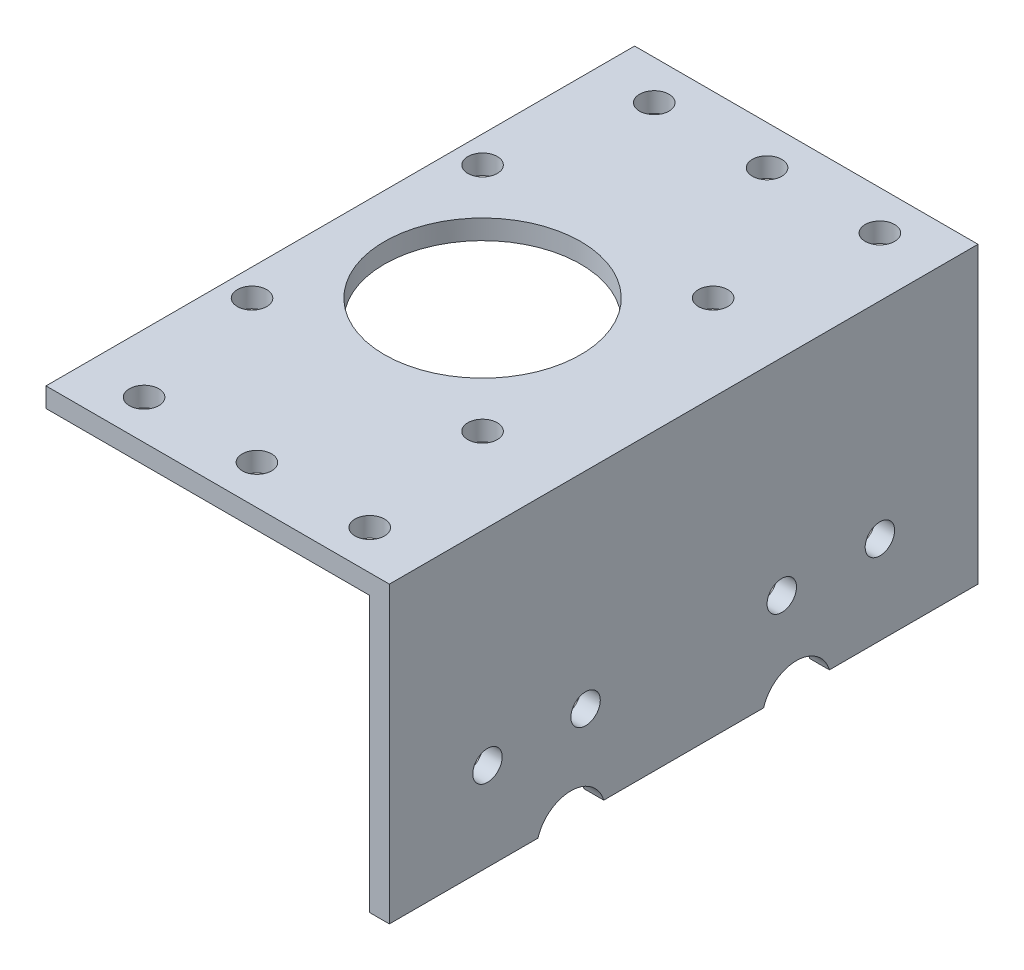
ISO-10303-21;
HEADER;
FILE_DESCRIPTION(('STEP AP214'),'2;1');
FILE_NAME('part.step','',(''),(''),'','','');
FILE_SCHEMA(('AUTOMOTIVE_DESIGN { 1 0 10303 214 1 1 1 1 }'));
ENDSEC;
DATA;
#1=APPLICATION_CONTEXT('core data for automotive mechanical design processes');
#2=APPLICATION_PROTOCOL_DEFINITION('international standard','automotive_design',2000,#1);
#3=PRODUCT_CONTEXT('',#1,'mechanical');
#4=PRODUCT('Part','Part','',(#3));
#5=PRODUCT_RELATED_PRODUCT_CATEGORY('part','',(#4));
#6=PRODUCT_DEFINITION_FORMATION('','',#4);
#7=PRODUCT_DEFINITION_CONTEXT('part definition',#1,'design');
#8=PRODUCT_DEFINITION('design','',#6,#7);
#9=PRODUCT_DEFINITION_SHAPE('','',#8);
#10=(LENGTH_UNIT() NAMED_UNIT(*) SI_UNIT(.MILLI.,.METRE.));
#11=(NAMED_UNIT(*) PLANE_ANGLE_UNIT() SI_UNIT($,.RADIAN.));
#12=(NAMED_UNIT(*) SI_UNIT($,.STERADIAN.) SOLID_ANGLE_UNIT());
#13=UNCERTAINTY_MEASURE_WITH_UNIT(LENGTH_MEASURE(1.E-05),#10,'distance_accuracy_value','');
#14=(GEOMETRIC_REPRESENTATION_CONTEXT(3) GLOBAL_UNCERTAINTY_ASSIGNED_CONTEXT((#13)) GLOBAL_UNIT_ASSIGNED_CONTEXT((#10,
#11,#12)) REPRESENTATION_CONTEXT('',''));
#15=CARTESIAN_POINT('',(0.,0.,0.));
#16=DIRECTION('',(0.,0.,1.));
#17=DIRECTION('',(1.,0.,0.));
#18=AXIS2_PLACEMENT_3D('',#15,#16,#17);
#19=CARTESIAN_POINT('',(0.,-60.,60.));
#20=DIRECTION('',(0.,1.,0.));
#21=DIRECTION('',(0.,0.,1.));
#22=AXIS2_PLACEMENT_3D('',#19,#20,#21);
#23=PLANE('',#22);
#24=DIRECTION('',(0.,0.,-1.));
#25=VECTOR('',#24,1.);
#26=CARTESIAN_POINT('',(-3.99999999999999,-60.,60.));
#27=LINE('',#26,#25);
#28=CARTESIAN_POINT('',(-3.99999999999999,-60.,16.2917960675006));
#29=VERTEX_POINT('',#28);
#30=CARTESIAN_POINT('',(-3.99999999999999,-60.,-16.2917960675006));
#31=VERTEX_POINT('',#30);
#32=EDGE_CURVE('E134',#29,#31,#27,.T.);
#33=ORIENTED_EDGE('',*,*,#32,.T.);
#34=DIRECTION('',(1.,0.,0.));
#35=VECTOR('',#34,1.);
#36=CARTESIAN_POINT('',(-9.99999999999999,-60.,-16.2917960675006));
#37=LINE('',#36,#35);
#38=CARTESIAN_POINT('',(0.,-60.,-16.2917960675006));
#39=VERTEX_POINT('',#38);
#40=EDGE_CURVE('E228',#31,#39,#37,.T.);
#41=ORIENTED_EDGE('',*,*,#40,.T.);
#42=DIRECTION('',(0.,0.,-1.));
#43=VECTOR('',#42,1.);
#44=CARTESIAN_POINT('',(0.,-60.,60.));
#45=LINE('',#44,#43);
#46=CARTESIAN_POINT('',(0.,-60.,16.2917960675006));
#47=VERTEX_POINT('',#46);
#48=EDGE_CURVE('E131',#47,#39,#45,.T.);
#49=ORIENTED_EDGE('',*,*,#48,.F.);
#50=DIRECTION('',(1.,0.,0.));
#51=VECTOR('',#50,1.);
#52=CARTESIAN_POINT('',(-9.99999999999999,-60.,16.2917960675006));
#53=LINE('',#52,#51);
#54=EDGE_CURVE('E54',#47,#29,#53,.F.);
#55=ORIENTED_EDGE('',*,*,#54,.T.);
#56=EDGE_LOOP('',(#33,#41,#49,#55));
#57=FACE_BOUND('',#56,.T.);
#58=ADVANCED_FACE('F32',(#57),#23,.F.);
#59=CARTESIAN_POINT('',(-3.99999999999999,-60.,60.));
#60=VERTEX_POINT('',#59);
#61=CARTESIAN_POINT('',(-3.99999999999999,-60.,29.7082039324994));
#62=VERTEX_POINT('',#61);
#63=EDGE_CURVE('E124',#60,#62,#27,.T.);
#64=ORIENTED_EDGE('',*,*,#63,.T.);
#65=DIRECTION('',(1.,0.,0.));
#66=VECTOR('',#65,1.);
#67=CARTESIAN_POINT('',(-9.99999999999999,-60.,29.7082039324994));
#68=LINE('',#67,#66);
#69=CARTESIAN_POINT('',(0.,-60.,29.7082039324994));
#70=VERTEX_POINT('',#69);
#71=EDGE_CURVE('E108',#62,#70,#68,.T.);
#72=ORIENTED_EDGE('',*,*,#71,.T.);
#73=CARTESIAN_POINT('',(0.,-60.,60.));
#74=VERTEX_POINT('',#73);
#75=EDGE_CURVE('E121',#74,#70,#45,.T.);
#76=ORIENTED_EDGE('',*,*,#75,.F.);
#77=DIRECTION('',(1.,0.,0.));
#78=VECTOR('',#77,1.);
#79=CARTESIAN_POINT('',(0.,-60.,60.));
#80=LINE('',#79,#78);
#81=EDGE_CURVE('E167',#60,#74,#80,.T.);
#82=ORIENTED_EDGE('',*,*,#81,.F.);
#83=EDGE_LOOP('',(#64,#72,#76,#82));
#84=FACE_BOUND('',#83,.T.);
#85=ADVANCED_FACE('F119',(#84),#23,.F.);
#86=CARTESIAN_POINT('',(-70.,-4.,60.));
#87=DIRECTION('',(1.,0.,0.));
#88=DIRECTION('',(0.,0.,-1.));
#89=AXIS2_PLACEMENT_3D('',#86,#87,#88);
#90=PLANE('',#89);
#91=DIRECTION('',(0.,-1.,0.));
#92=VECTOR('',#91,1.);
#93=CARTESIAN_POINT('',(-70.,-4.,-60.));
#94=LINE('',#93,#92);
#95=CARTESIAN_POINT('',(-70.,0.,-60.));
#96=VERTEX_POINT('',#95);
#97=CARTESIAN_POINT('',(-70.,-4.,-60.));
#98=VERTEX_POINT('',#97);
#99=EDGE_CURVE('E161',#96,#98,#94,.T.);
#100=ORIENTED_EDGE('',*,*,#99,.T.);
#101=DIRECTION('',(0.,0.,-1.));
#102=VECTOR('',#101,1.);
#103=CARTESIAN_POINT('',(-70.,-4.,60.));
#104=LINE('',#103,#102);
#105=CARTESIAN_POINT('',(-70.,-4.,60.));
#106=VERTEX_POINT('',#105);
#107=EDGE_CURVE('E40',#106,#98,#104,.T.);
#108=ORIENTED_EDGE('',*,*,#107,.F.);
#109=DIRECTION('',(0.,-1.,0.));
#110=VECTOR('',#109,1.);
#111=CARTESIAN_POINT('',(-70.,-4.,60.));
#112=LINE('',#111,#110);
#113=CARTESIAN_POINT('',(-70.,0.,60.));
#114=VERTEX_POINT('',#113);
#115=EDGE_CURVE('E151',#114,#106,#112,.T.);
#116=ORIENTED_EDGE('',*,*,#115,.F.);
#117=DIRECTION('',(0.,0.,-1.));
#118=VECTOR('',#117,1.);
#119=CARTESIAN_POINT('',(-70.,0.,60.));
#120=LINE('',#119,#118);
#121=EDGE_CURVE('E141',#114,#96,#120,.T.);
#122=ORIENTED_EDGE('',*,*,#121,.T.);
#123=EDGE_LOOP('',(#100,#108,#116,#122));
#124=FACE_BOUND('',#123,.T.);
#125=ADVANCED_FACE('F34',(#124),#90,.F.);
#126=CARTESIAN_POINT('',(-3.99999999999999,-3.99999999999999,60.));
#127=DIRECTION('',(0.,1.,0.));
#128=DIRECTION('',(-1.,0.,0.));
#129=AXIS2_PLACEMENT_3D('',#126,#127,#128);
#130=PLANE('',#129);
#131=CARTESIAN_POINT('',(-35.,-3.99999999999999,52.));
#132=DIRECTION('',(0.,1.,0.));
#133=DIRECTION('',(-1.,0.,0.));
#134=AXIS2_PLACEMENT_3D('',#131,#132,#133);
#135=CIRCLE('',#134,3.);
#136=CARTESIAN_POINT('',(-38.,-4.,52.));
#137=VERTEX_POINT('',#136);
#138=EDGE_CURVE('E114',#137,#137,#135,.T.);
#139=ORIENTED_EDGE('',*,*,#138,.T.);
#140=EDGE_LOOP('',(#139));
#141=FACE_BOUND('',#140,.T.);
#142=CARTESIAN_POINT('',(-12.,-3.99999999999999,52.));
#143=DIRECTION('',(0.,1.,0.));
#144=DIRECTION('',(-1.,0.,0.));
#145=AXIS2_PLACEMENT_3D('',#142,#143,#144);
#146=CIRCLE('',#145,3.);
#147=CARTESIAN_POINT('',(-15.,-3.99999999999999,52.));
#148=VERTEX_POINT('',#147);
#149=EDGE_CURVE('E239',#148,#148,#146,.T.);
#150=ORIENTED_EDGE('',*,*,#149,.T.);
#151=EDGE_LOOP('',(#150));
#152=FACE_BOUND('',#151,.T.);
#153=CARTESIAN_POINT('',(-58.,-4.,-52.));
#154=DIRECTION('',(0.,1.,0.));
#155=DIRECTION('',(-1.,0.,0.));
#156=AXIS2_PLACEMENT_3D('',#153,#154,#155);
#157=CIRCLE('',#156,3.00000000000001);
#158=CARTESIAN_POINT('',(-61.,-4.,-52.));
#159=VERTEX_POINT('',#158);
#160=EDGE_CURVE('E242',#159,#159,#157,.T.);
#161=ORIENTED_EDGE('',*,*,#160,.T.);
#162=EDGE_LOOP('',(#161));
#163=FACE_BOUND('',#162,.T.);
#164=CARTESIAN_POINT('',(-35.,-3.99999999999999,-52.));
#165=DIRECTION('',(0.,1.,0.));
#166=DIRECTION('',(-1.,0.,0.));
#167=AXIS2_PLACEMENT_3D('',#164,#165,#166);
#168=CIRCLE('',#167,3.);
#169=CARTESIAN_POINT('',(-38.,-4.,-52.));
#170=VERTEX_POINT('',#169);
#171=EDGE_CURVE('E245',#170,#170,#168,.T.);
#172=ORIENTED_EDGE('',*,*,#171,.T.);
#173=EDGE_LOOP('',(#172));
#174=FACE_BOUND('',#173,.T.);
#175=CARTESIAN_POINT('',(-12.,-3.99999999999999,-52.));
#176=DIRECTION('',(0.,1.,0.));
#177=DIRECTION('',(-1.,0.,0.));
#178=AXIS2_PLACEMENT_3D('',#175,#176,#177);
#179=CIRCLE('',#178,3.);
#180=CARTESIAN_POINT('',(-15.,-3.99999999999999,-52.));
#181=VERTEX_POINT('',#180);
#182=EDGE_CURVE('E248',#181,#181,#179,.T.);
#183=ORIENTED_EDGE('',*,*,#182,.T.);
#184=EDGE_LOOP('',(#183));
#185=FACE_BOUND('',#184,.T.);
#186=CARTESIAN_POINT('',(-58.,-4.,52.));
#187=DIRECTION('',(0.,1.,0.));
#188=DIRECTION('',(-1.,0.,0.));
#189=AXIS2_PLACEMENT_3D('',#186,#187,#188);
#190=CIRCLE('',#189,3.00000000000001);
#191=CARTESIAN_POINT('',(-61.,-4.,52.));
#192=VERTEX_POINT('',#191);
#193=EDGE_CURVE('E251',#192,#192,#190,.T.);
#194=ORIENTED_EDGE('',*,*,#193,.T.);
#195=EDGE_LOOP('',(#194));
#196=FACE_BOUND('',#195,.T.);
#197=CARTESIAN_POINT('',(-64.5,-4.,23.5));
#198=DIRECTION('',(0.,1.,0.));
#199=DIRECTION('',(-1.,0.,0.));
#200=AXIS2_PLACEMENT_3D('',#197,#198,#199);
#201=CIRCLE('',#200,3.00000000000001);
#202=CARTESIAN_POINT('',(-67.5,-4.,23.5));
#203=VERTEX_POINT('',#202);
#204=EDGE_CURVE('E164',#203,#203,#201,.T.);
#205=ORIENTED_EDGE('',*,*,#204,.T.);
#206=EDGE_LOOP('',(#205));
#207=FACE_BOUND('',#206,.T.);
#208=CARTESIAN_POINT('',(-17.5,-3.99999999999999,23.5));
#209=DIRECTION('',(0.,1.,0.));
#210=DIRECTION('',(-1.,0.,0.));
#211=AXIS2_PLACEMENT_3D('',#208,#209,#210);
#212=CIRCLE('',#211,3.);
#213=CARTESIAN_POINT('',(-20.5,-3.99999999999999,23.5));
#214=VERTEX_POINT('',#213);
#215=EDGE_CURVE('E177',#214,#214,#212,.T.);
#216=ORIENTED_EDGE('',*,*,#215,.T.);
#217=EDGE_LOOP('',(#216));
#218=FACE_BOUND('',#217,.T.);
#219=CARTESIAN_POINT('',(-64.5,-4.,-23.5));
#220=DIRECTION('',(0.,1.,0.));
#221=DIRECTION('',(-1.,0.,0.));
#222=AXIS2_PLACEMENT_3D('',#219,#220,#221);
#223=CIRCLE('',#222,3.00000000000001);
#224=CARTESIAN_POINT('',(-67.5,-4.,-23.5));
#225=VERTEX_POINT('',#224);
#226=EDGE_CURVE('E180',#225,#225,#223,.T.);
#227=ORIENTED_EDGE('',*,*,#226,.T.);
#228=EDGE_LOOP('',(#227));
#229=FACE_BOUND('',#228,.T.);
#230=CARTESIAN_POINT('',(-17.5,-3.99999999999999,-23.5));
#231=DIRECTION('',(0.,1.,0.));
#232=DIRECTION('',(-1.,0.,0.));
#233=AXIS2_PLACEMENT_3D('',#230,#231,#232);
#234=CIRCLE('',#233,3.);
#235=CARTESIAN_POINT('',(-20.5,-3.99999999999999,-23.5));
#236=VERTEX_POINT('',#235);
#237=EDGE_CURVE('E183',#236,#236,#234,.T.);
#238=ORIENTED_EDGE('',*,*,#237,.T.);
#239=EDGE_LOOP('',(#238));
#240=FACE_BOUND('',#239,.T.);
#241=CARTESIAN_POINT('',(-41.,-4.,0.));
#242=DIRECTION('',(0.,1.,0.));
#243=DIRECTION('',(-1.,0.,0.));
#244=AXIS2_PLACEMENT_3D('',#241,#242,#243);
#245=CIRCLE('',#244,20.);
#246=CARTESIAN_POINT('',(-61.,-4.,0.));
#247=VERTEX_POINT('',#246);
#248=EDGE_CURVE('E186',#247,#247,#245,.T.);
#249=ORIENTED_EDGE('',*,*,#248,.T.);
#250=EDGE_LOOP('',(#249));
#251=FACE_BOUND('',#250,.T.);
#252=DIRECTION('',(1.,0.,0.));
#253=VECTOR('',#252,1.);
#254=CARTESIAN_POINT('',(-3.99999999999999,-3.99999999999999,-60.));
#255=LINE('',#254,#253);
#256=CARTESIAN_POINT('',(-3.99999999999999,-3.99999999999999,-60.));
#257=VERTEX_POINT('',#256);
#258=EDGE_CURVE('E159',#98,#257,#255,.T.);
#259=ORIENTED_EDGE('',*,*,#258,.T.);
#260=DIRECTION('',(0.,0.,-1.));
#261=VECTOR('',#260,1.);
#262=CARTESIAN_POINT('',(-3.99999999999999,-3.99999999999999,60.));
#263=LINE('',#262,#261);
#264=CARTESIAN_POINT('',(-3.99999999999999,-3.99999999999999,60.));
#265=VERTEX_POINT('',#264);
#266=EDGE_CURVE('E308',#265,#257,#263,.T.);
#267=ORIENTED_EDGE('',*,*,#266,.F.);
#268=DIRECTION('',(1.,0.,0.));
#269=VECTOR('',#268,1.);
#270=CARTESIAN_POINT('',(-3.99999999999999,-3.99999999999999,60.));
#271=LINE('',#270,#269);
#272=EDGE_CURVE('E171',#106,#265,#271,.T.);
#273=ORIENTED_EDGE('',*,*,#272,.F.);
#274=ORIENTED_EDGE('',*,*,#107,.T.);
#275=EDGE_LOOP('',(#259,#267,#273,#274));
#276=FACE_BOUND('',#275,.T.);
#277=ADVANCED_FACE('F307',(#141,#152,#163,#174,#185,#196,#207,#218,#229,#240,#251,#276),#130,.F.);
#278=CARTESIAN_POINT('',(-3.99999999999999,-60.,60.));
#279=DIRECTION('',(1.,0.,0.));
#280=DIRECTION('',(0.,0.,-1.));
#281=AXIS2_PLACEMENT_3D('',#278,#279,#280);
#282=PLANE('',#281);
#283=CARTESIAN_POINT('',(-3.99999999999999,-42.,-40.));
#284=DIRECTION('',(1.,0.,0.));
#285=DIRECTION('',(0.,0.,-1.));
#286=AXIS2_PLACEMENT_3D('',#283,#284,#285);
#287=CIRCLE('',#286,2.99999999999999);
#288=CARTESIAN_POINT('',(-3.99999999999999,-42.,-43.));
#289=VERTEX_POINT('',#288);
#290=EDGE_CURVE('E197',#289,#289,#287,.T.);
#291=ORIENTED_EDGE('',*,*,#290,.T.);
#292=EDGE_LOOP('',(#291));
#293=FACE_BOUND('',#292,.T.);
#294=CARTESIAN_POINT('',(-3.99999999999999,-42.,40.));
#295=DIRECTION('',(1.,0.,0.));
#296=DIRECTION('',(0.,0.,-1.));
#297=AXIS2_PLACEMENT_3D('',#294,#295,#296);
#298=CIRCLE('',#297,2.99999999999999);
#299=CARTESIAN_POINT('',(-3.99999999999999,-42.,37.));
#300=VERTEX_POINT('',#299);
#301=EDGE_CURVE('E207',#300,#300,#298,.T.);
#302=ORIENTED_EDGE('',*,*,#301,.T.);
#303=EDGE_LOOP('',(#302));
#304=FACE_BOUND('',#303,.T.);
#305=CARTESIAN_POINT('',(-3.99999999999999,-42.,20.));
#306=DIRECTION('',(1.,0.,0.));
#307=DIRECTION('',(0.,0.,-1.));
#308=AXIS2_PLACEMENT_3D('',#305,#306,#307);
#309=CIRCLE('',#308,3.);
#310=CARTESIAN_POINT('',(-3.99999999999999,-42.,17.));
#311=VERTEX_POINT('',#310);
#312=EDGE_CURVE('E210',#311,#311,#309,.T.);
#313=ORIENTED_EDGE('',*,*,#312,.T.);
#314=EDGE_LOOP('',(#313));
#315=FACE_BOUND('',#314,.T.);
#316=CARTESIAN_POINT('',(-3.99999999999999,-42.,-20.));
#317=DIRECTION('',(1.,0.,0.));
#318=DIRECTION('',(0.,0.,-1.));
#319=AXIS2_PLACEMENT_3D('',#316,#317,#318);
#320=CIRCLE('',#319,3.);
#321=CARTESIAN_POINT('',(-3.99999999999999,-42.,-23.));
#322=VERTEX_POINT('',#321);
#323=EDGE_CURVE('E213',#322,#322,#320,.T.);
#324=ORIENTED_EDGE('',*,*,#323,.T.);
#325=EDGE_LOOP('',(#324));
#326=FACE_BOUND('',#325,.T.);
#327=CARTESIAN_POINT('',(-3.99999999999999,-60.,-29.7082039324994));
#328=VERTEX_POINT('',#327);
#329=CARTESIAN_POINT('',(-3.99999999999999,-60.,-60.));
#330=VERTEX_POINT('',#329);
#331=EDGE_CURVE('E130',#328,#330,#27,.T.);
#332=ORIENTED_EDGE('',*,*,#331,.F.);
#333=CARTESIAN_POINT('',(-3.99999999999999,-62.,-23.));
#334=DIRECTION('',(1.,0.,0.));
#335=DIRECTION('',(0.,0.,-1.));
#336=AXIS2_PLACEMENT_3D('',#333,#334,#335);
#337=CIRCLE('',#336,7.);
#338=EDGE_CURVE('E231',#328,#31,#337,.T.);
#339=ORIENTED_EDGE('',*,*,#338,.T.);
#340=ORIENTED_EDGE('',*,*,#32,.F.);
#341=CARTESIAN_POINT('',(-3.99999999999999,-62.,23.));
#342=DIRECTION('',(1.,0.,0.));
#343=DIRECTION('',(0.,0.,-1.));
#344=AXIS2_PLACEMENT_3D('',#341,#342,#343);
#345=CIRCLE('',#344,7.);
#346=EDGE_CURVE('E125',#29,#62,#345,.T.);
#347=ORIENTED_EDGE('',*,*,#346,.T.);
#348=ORIENTED_EDGE('',*,*,#63,.F.);
#349=DIRECTION('',(0.,-1.,0.));
#350=VECTOR('',#349,1.);
#351=CARTESIAN_POINT('',(-3.99999999999999,-60.,60.));
#352=LINE('',#351,#350);
#353=EDGE_CURVE('E169',#265,#60,#352,.T.);
#354=ORIENTED_EDGE('',*,*,#353,.F.);
#355=ORIENTED_EDGE('',*,*,#266,.T.);
#356=DIRECTION('',(0.,-1.,0.));
#357=VECTOR('',#356,1.);
#358=CARTESIAN_POINT('',(-3.99999999999999,-60.,-60.));
#359=LINE('',#358,#357);
#360=EDGE_CURVE('E156',#257,#330,#359,.T.);
#361=ORIENTED_EDGE('',*,*,#360,.T.);
#362=EDGE_LOOP('',(#332,#339,#340,#347,#348,#354,#355,#361));
#363=FACE_BOUND('',#362,.T.);
#364=ADVANCED_FACE('F315',(#293,#304,#315,#326,#363),#282,.F.);
#365=CARTESIAN_POINT('',(0.,-60.,-29.7082039324994));
#366=VERTEX_POINT('',#365);
#367=CARTESIAN_POINT('',(0.,-60.,-60.));
#368=VERTEX_POINT('',#367);
#369=EDGE_CURVE('E133',#366,#368,#45,.T.);
#370=ORIENTED_EDGE('',*,*,#369,.F.);
#371=DIRECTION('',(1.,0.,0.));
#372=VECTOR('',#371,1.);
#373=CARTESIAN_POINT('',(-9.99999999999999,-60.,-29.7082039324994));
#374=LINE('',#373,#372);
#375=EDGE_CURVE('E47',#366,#328,#374,.F.);
#376=ORIENTED_EDGE('',*,*,#375,.T.);
#377=ORIENTED_EDGE('',*,*,#331,.T.);
#378=DIRECTION('',(1.,0.,0.));
#379=VECTOR('',#378,1.);
#380=CARTESIAN_POINT('',(0.,-60.,-60.));
#381=LINE('',#380,#379);
#382=EDGE_CURVE('E154',#330,#368,#381,.T.);
#383=ORIENTED_EDGE('',*,*,#382,.T.);
#384=EDGE_LOOP('',(#370,#376,#377,#383));
#385=FACE_BOUND('',#384,.T.);
#386=ADVANCED_FACE('F318',(#385),#23,.F.);
#387=CARTESIAN_POINT('',(0.,0.,60.));
#388=DIRECTION('',(-1.,0.,0.));
#389=DIRECTION('',(0.,-1.,0.));
#390=AXIS2_PLACEMENT_3D('',#387,#388,#389);
#391=PLANE('',#390);
#392=CARTESIAN_POINT('',(0.,-42.,-40.));
#393=DIRECTION('',(1.,0.,0.));
#394=DIRECTION('',(0.,1.,0.));
#395=AXIS2_PLACEMENT_3D('',#392,#393,#394);
#396=CIRCLE('',#395,2.99999999999999);
#397=CARTESIAN_POINT('',(0.,-39.,-40.));
#398=VERTEX_POINT('',#397);
#399=EDGE_CURVE('E219',#398,#398,#396,.T.);
#400=ORIENTED_EDGE('',*,*,#399,.F.);
#401=EDGE_LOOP('',(#400));
#402=FACE_BOUND('',#401,.T.);
#403=CARTESIAN_POINT('',(0.,-42.,40.));
#404=DIRECTION('',(1.,0.,0.));
#405=DIRECTION('',(0.,-1.,0.));
#406=AXIS2_PLACEMENT_3D('',#403,#404,#405);
#407=CIRCLE('',#406,2.99999999999999);
#408=CARTESIAN_POINT('',(0.,-45.,40.));
#409=VERTEX_POINT('',#408);
#410=EDGE_CURVE('E220',#409,#409,#407,.T.);
#411=ORIENTED_EDGE('',*,*,#410,.F.);
#412=EDGE_LOOP('',(#411));
#413=FACE_BOUND('',#412,.T.);
#414=CARTESIAN_POINT('',(0.,-42.,20.));
#415=DIRECTION('',(1.,0.,0.));
#416=DIRECTION('',(0.,-1.,0.));
#417=AXIS2_PLACEMENT_3D('',#414,#415,#416);
#418=CIRCLE('',#417,3.);
#419=CARTESIAN_POINT('',(0.,-45.,20.));
#420=VERTEX_POINT('',#419);
#421=EDGE_CURVE('E223',#420,#420,#418,.T.);
#422=ORIENTED_EDGE('',*,*,#421,.F.);
#423=EDGE_LOOP('',(#422));
#424=FACE_BOUND('',#423,.T.);
#425=CARTESIAN_POINT('',(0.,-42.,-20.));
#426=DIRECTION('',(1.,0.,0.));
#427=DIRECTION('',(0.,1.,0.));
#428=AXIS2_PLACEMENT_3D('',#425,#426,#427);
#429=CIRCLE('',#428,3.);
#430=CARTESIAN_POINT('',(0.,-39.,-20.));
#431=VERTEX_POINT('',#430);
#432=EDGE_CURVE('E216',#431,#431,#429,.T.);
#433=ORIENTED_EDGE('',*,*,#432,.F.);
#434=EDGE_LOOP('',(#433));
#435=FACE_BOUND('',#434,.T.);
#436=ORIENTED_EDGE('',*,*,#48,.T.);
#437=CARTESIAN_POINT('',(0.,-62.,-23.));
#438=DIRECTION('',(-1.,0.,0.));
#439=DIRECTION('',(0.,-1.,0.));
#440=AXIS2_PLACEMENT_3D('',#437,#438,#439);
#441=CIRCLE('',#440,7.);
#442=EDGE_CURVE('E11',#39,#366,#441,.T.);
#443=ORIENTED_EDGE('',*,*,#442,.T.);
#444=ORIENTED_EDGE('',*,*,#369,.T.);
#445=DIRECTION('',(0.,1.,0.));
#446=VECTOR('',#445,1.);
#447=CARTESIAN_POINT('',(0.,0.,-60.));
#448=LINE('',#447,#446);
#449=CARTESIAN_POINT('',(0.,0.,-60.));
#450=VERTEX_POINT('',#449);
#451=EDGE_CURVE('E152',#368,#450,#448,.T.);
#452=ORIENTED_EDGE('',*,*,#451,.T.);
#453=DIRECTION('',(0.,0.,-1.));
#454=VECTOR('',#453,1.);
#455=CARTESIAN_POINT('',(0.,0.,60.));
#456=LINE('',#455,#454);
#457=CARTESIAN_POINT('',(0.,0.,60.));
#458=VERTEX_POINT('',#457);
#459=EDGE_CURVE('E137',#458,#450,#456,.T.);
#460=ORIENTED_EDGE('',*,*,#459,.F.);
#461=DIRECTION('',(0.,1.,0.));
#462=VECTOR('',#461,1.);
#463=CARTESIAN_POINT('',(0.,0.,60.));
#464=LINE('',#463,#462);
#465=EDGE_CURVE('E129',#74,#458,#464,.T.);
#466=ORIENTED_EDGE('',*,*,#465,.F.);
#467=ORIENTED_EDGE('',*,*,#75,.T.);
#468=CARTESIAN_POINT('',(0.,-62.,23.));
#469=DIRECTION('',(1.,0.,0.));
#470=DIRECTION('',(0.,-1.,0.));
#471=AXIS2_PLACEMENT_3D('',#468,#469,#470);
#472=CIRCLE('',#471,7.);
#473=EDGE_CURVE('E105',#47,#70,#472,.T.);
#474=ORIENTED_EDGE('',*,*,#473,.F.);
#475=EDGE_LOOP('',(#436,#443,#444,#452,#460,#466,#467,#474));
#476=FACE_BOUND('',#475,.T.);
#477=ADVANCED_FACE('F127',(#402,#413,#424,#435,#476),#391,.F.);
#478=CARTESIAN_POINT('',(-70.,0.,60.));
#479=DIRECTION('',(0.,-1.,0.));
#480=DIRECTION('',(0.,0.,-1.));
#481=AXIS2_PLACEMENT_3D('',#478,#479,#480);
#482=PLANE('',#481);
#483=CARTESIAN_POINT('',(-35.,0.,52.));
#484=DIRECTION('',(0.,1.,0.));
#485=DIRECTION('',(0.,0.,1.));
#486=AXIS2_PLACEMENT_3D('',#483,#484,#485);
#487=CIRCLE('',#486,3.);
#488=CARTESIAN_POINT('',(-35.,0.,55.));
#489=VERTEX_POINT('',#488);
#490=EDGE_CURVE('E257',#489,#489,#487,.T.);
#491=ORIENTED_EDGE('',*,*,#490,.F.);
#492=EDGE_LOOP('',(#491));
#493=FACE_BOUND('',#492,.T.);
#494=CARTESIAN_POINT('',(-12.,0.,52.));
#495=DIRECTION('',(0.,1.,0.));
#496=DIRECTION('',(0.,0.,1.));
#497=AXIS2_PLACEMENT_3D('',#494,#495,#496);
#498=CIRCLE('',#497,3.);
#499=CARTESIAN_POINT('',(-12.,0.,55.));
#500=VERTEX_POINT('',#499);
#501=EDGE_CURVE('E265',#500,#500,#498,.T.);
#502=ORIENTED_EDGE('',*,*,#501,.F.);
#503=EDGE_LOOP('',(#502));
#504=FACE_BOUND('',#503,.T.);
#505=CARTESIAN_POINT('',(-58.,0.,-52.));
#506=DIRECTION('',(0.,1.,0.));
#507=DIRECTION('',(0.,0.,-1.));
#508=AXIS2_PLACEMENT_3D('',#505,#506,#507);
#509=CIRCLE('',#508,3.00000000000001);
#510=CARTESIAN_POINT('',(-58.,0.,-55.));
#511=VERTEX_POINT('',#510);
#512=EDGE_CURVE('E261',#511,#511,#509,.T.);
#513=ORIENTED_EDGE('',*,*,#512,.F.);
#514=EDGE_LOOP('',(#513));
#515=FACE_BOUND('',#514,.T.);
#516=CARTESIAN_POINT('',(-35.,0.,-52.));
#517=DIRECTION('',(0.,1.,0.));
#518=DIRECTION('',(0.,0.,-1.));
#519=AXIS2_PLACEMENT_3D('',#516,#517,#518);
#520=CIRCLE('',#519,3.);
#521=CARTESIAN_POINT('',(-35.,0.,-55.));
#522=VERTEX_POINT('',#521);
#523=EDGE_CURVE('E258',#522,#522,#520,.T.);
#524=ORIENTED_EDGE('',*,*,#523,.F.);
#525=EDGE_LOOP('',(#524));
#526=FACE_BOUND('',#525,.T.);
#527=CARTESIAN_POINT('',(-12.,0.,-52.));
#528=DIRECTION('',(0.,1.,0.));
#529=DIRECTION('',(0.,0.,-1.));
#530=AXIS2_PLACEMENT_3D('',#527,#528,#529);
#531=CIRCLE('',#530,3.);
#532=CARTESIAN_POINT('',(-12.,0.,-55.));
#533=VERTEX_POINT('',#532);
#534=EDGE_CURVE('E262',#533,#533,#531,.T.);
#535=ORIENTED_EDGE('',*,*,#534,.F.);
#536=EDGE_LOOP('',(#535));
#537=FACE_BOUND('',#536,.T.);
#538=CARTESIAN_POINT('',(-58.,0.,52.));
#539=DIRECTION('',(0.,1.,0.));
#540=DIRECTION('',(0.,0.,1.));
#541=AXIS2_PLACEMENT_3D('',#538,#539,#540);
#542=CIRCLE('',#541,3.00000000000001);
#543=CARTESIAN_POINT('',(-58.,0.,55.));
#544=VERTEX_POINT('',#543);
#545=EDGE_CURVE('E254',#544,#544,#542,.T.);
#546=ORIENTED_EDGE('',*,*,#545,.F.);
#547=EDGE_LOOP('',(#546));
#548=FACE_BOUND('',#547,.T.);
#549=CARTESIAN_POINT('',(-64.5,0.,23.5));
#550=DIRECTION('',(0.,1.,0.));
#551=DIRECTION('',(0.,0.,1.));
#552=AXIS2_PLACEMENT_3D('',#549,#550,#551);
#553=CIRCLE('',#552,3.00000000000001);
#554=CARTESIAN_POINT('',(-64.5,0.,26.5));
#555=VERTEX_POINT('',#554);
#556=EDGE_CURVE('E193',#555,#555,#553,.T.);
#557=ORIENTED_EDGE('',*,*,#556,.F.);
#558=EDGE_LOOP('',(#557));
#559=FACE_BOUND('',#558,.T.);
#560=CARTESIAN_POINT('',(-17.5,0.,23.5));
#561=DIRECTION('',(0.,1.,0.));
#562=DIRECTION('',(0.,0.,-1.));
#563=AXIS2_PLACEMENT_3D('',#560,#561,#562);
#564=CIRCLE('',#563,3.);
#565=CARTESIAN_POINT('',(-17.5,0.,20.5));
#566=VERTEX_POINT('',#565);
#567=EDGE_CURVE('E196',#566,#566,#564,.T.);
#568=ORIENTED_EDGE('',*,*,#567,.F.);
#569=EDGE_LOOP('',(#568));
#570=FACE_BOUND('',#569,.T.);
#571=CARTESIAN_POINT('',(-64.5,0.,-23.5));
#572=DIRECTION('',(0.,1.,0.));
#573=DIRECTION('',(0.,0.,-1.));
#574=AXIS2_PLACEMENT_3D('',#571,#572,#573);
#575=CIRCLE('',#574,3.00000000000001);
#576=CARTESIAN_POINT('',(-64.5,0.,-26.5));
#577=VERTEX_POINT('',#576);
#578=EDGE_CURVE('E200',#577,#577,#575,.T.);
#579=ORIENTED_EDGE('',*,*,#578,.F.);
#580=EDGE_LOOP('',(#579));
#581=FACE_BOUND('',#580,.T.);
#582=CARTESIAN_POINT('',(-17.5,0.,-23.5));
#583=DIRECTION('',(0.,1.,0.));
#584=DIRECTION('',(0.,0.,1.));
#585=AXIS2_PLACEMENT_3D('',#582,#583,#584);
#586=CIRCLE('',#585,3.);
#587=CARTESIAN_POINT('',(-17.5,0.,-20.5));
#588=VERTEX_POINT('',#587);
#589=EDGE_CURVE('E192',#588,#588,#586,.T.);
#590=ORIENTED_EDGE('',*,*,#589,.F.);
#591=EDGE_LOOP('',(#590));
#592=FACE_BOUND('',#591,.T.);
#593=CARTESIAN_POINT('',(-41.,0.,0.));
#594=DIRECTION('',(0.,1.,0.));
#595=DIRECTION('',(0.,0.,1.));
#596=AXIS2_PLACEMENT_3D('',#593,#594,#595);
#597=CIRCLE('',#596,20.);
#598=CARTESIAN_POINT('',(-41.,0.,20.));
#599=VERTEX_POINT('',#598);
#600=EDGE_CURVE('E189',#599,#599,#597,.T.);
#601=ORIENTED_EDGE('',*,*,#600,.F.);
#602=EDGE_LOOP('',(#601));
#603=FACE_BOUND('',#602,.T.);
#604=DIRECTION('',(-1.,0.,0.));
#605=VECTOR('',#604,1.);
#606=CARTESIAN_POINT('',(-70.,0.,-60.));
#607=LINE('',#606,#605);
#608=EDGE_CURVE('E149',#450,#96,#607,.T.);
#609=ORIENTED_EDGE('',*,*,#608,.T.);
#610=ORIENTED_EDGE('',*,*,#121,.F.);
#611=DIRECTION('',(-1.,0.,0.));
#612=VECTOR('',#611,1.);
#613=CARTESIAN_POINT('',(-70.,0.,60.));
#614=LINE('',#613,#612);
#615=EDGE_CURVE('E146',#458,#114,#614,.T.);
#616=ORIENTED_EDGE('',*,*,#615,.F.);
#617=ORIENTED_EDGE('',*,*,#459,.T.);
#618=EDGE_LOOP('',(#609,#610,#616,#617));
#619=FACE_BOUND('',#618,.T.);
#620=ADVANCED_FACE('F276',(#493,#504,#515,#526,#537,#548,#559,#570,#581,#592,#603,#619),#482,.F.);
#621=CARTESIAN_POINT('',(0.,0.,60.));
#622=DIRECTION('',(0.,0.,-1.));
#623=DIRECTION('',(-1.,0.,0.));
#624=AXIS2_PLACEMENT_3D('',#621,#622,#623);
#625=PLANE('',#624);
#626=ORIENTED_EDGE('',*,*,#115,.T.);
#627=ORIENTED_EDGE('',*,*,#272,.T.);
#628=ORIENTED_EDGE('',*,*,#353,.T.);
#629=ORIENTED_EDGE('',*,*,#81,.T.);
#630=ORIENTED_EDGE('',*,*,#465,.T.);
#631=ORIENTED_EDGE('',*,*,#615,.T.);
#632=EDGE_LOOP('',(#626,#627,#628,#629,#630,#631));
#633=FACE_BOUND('',#632,.T.);
#634=ADVANCED_FACE('F279',(#633),#625,.F.);
#635=CARTESIAN_POINT('',(0.,0.,-60.));
#636=DIRECTION('',(0.,0.,-1.));
#637=DIRECTION('',(-1.,0.,0.));
#638=AXIS2_PLACEMENT_3D('',#635,#636,#637);
#639=PLANE('',#638);
#640=ORIENTED_EDGE('',*,*,#99,.F.);
#641=ORIENTED_EDGE('',*,*,#608,.F.);
#642=ORIENTED_EDGE('',*,*,#451,.F.);
#643=ORIENTED_EDGE('',*,*,#382,.F.);
#644=ORIENTED_EDGE('',*,*,#360,.F.);
#645=ORIENTED_EDGE('',*,*,#258,.F.);
#646=EDGE_LOOP('',(#640,#641,#642,#643,#644,#645));
#647=FACE_BOUND('',#646,.T.);
#648=ADVANCED_FACE('F300',(#647),#639,.T.);
#649=CARTESIAN_POINT('',(-41.,-20.,0.));
#650=DIRECTION('',(0.,1.,0.));
#651=DIRECTION('',(0.,0.,1.));
#652=AXIS2_PLACEMENT_3D('',#649,#650,#651);
#653=CYLINDRICAL_SURFACE('',#652,20.);
#654=ORIENTED_EDGE('',*,*,#600,.T.);
#655=EDGE_LOOP('',(#654));
#656=FACE_BOUND('',#655,.T.);
#657=ORIENTED_EDGE('',*,*,#248,.F.);
#658=EDGE_LOOP('',(#657));
#659=FACE_BOUND('',#658,.T.);
#660=ADVANCED_FACE('F326',(#656,#659),#653,.F.);
#661=CARTESIAN_POINT('',(-17.5,-20.,-23.5));
#662=DIRECTION('',(0.,1.,0.));
#663=DIRECTION('',(0.,0.,1.));
#664=AXIS2_PLACEMENT_3D('',#661,#662,#663);
#665=CYLINDRICAL_SURFACE('',#664,3.);
#666=ORIENTED_EDGE('',*,*,#589,.T.);
#667=EDGE_LOOP('',(#666));
#668=FACE_BOUND('',#667,.T.);
#669=ORIENTED_EDGE('',*,*,#237,.F.);
#670=EDGE_LOOP('',(#669));
#671=FACE_BOUND('',#670,.T.);
#672=ADVANCED_FACE('F374',(#668,#671),#665,.F.);
#673=CARTESIAN_POINT('',(-64.5,-20.,-23.5));
#674=DIRECTION('',(0.,1.,0.));
#675=DIRECTION('',(0.,0.,1.));
#676=AXIS2_PLACEMENT_3D('',#673,#674,#675);
#677=CYLINDRICAL_SURFACE('',#676,3.00000000000001);
#678=ORIENTED_EDGE('',*,*,#578,.T.);
#679=EDGE_LOOP('',(#678));
#680=FACE_BOUND('',#679,.T.);
#681=ORIENTED_EDGE('',*,*,#226,.F.);
#682=EDGE_LOOP('',(#681));
#683=FACE_BOUND('',#682,.T.);
#684=ADVANCED_FACE('F377',(#680,#683),#677,.F.);
#685=CARTESIAN_POINT('',(-17.5,-20.,23.5));
#686=DIRECTION('',(0.,1.,0.));
#687=DIRECTION('',(0.,0.,1.));
#688=AXIS2_PLACEMENT_3D('',#685,#686,#687);
#689=CYLINDRICAL_SURFACE('',#688,3.);
#690=ORIENTED_EDGE('',*,*,#567,.T.);
#691=EDGE_LOOP('',(#690));
#692=FACE_BOUND('',#691,.T.);
#693=ORIENTED_EDGE('',*,*,#215,.F.);
#694=EDGE_LOOP('',(#693));
#695=FACE_BOUND('',#694,.T.);
#696=ADVANCED_FACE('F368',(#692,#695),#689,.F.);
#697=CARTESIAN_POINT('',(-64.5,-20.,23.5));
#698=DIRECTION('',(0.,1.,0.));
#699=DIRECTION('',(0.,0.,1.));
#700=AXIS2_PLACEMENT_3D('',#697,#698,#699);
#701=CYLINDRICAL_SURFACE('',#700,3.00000000000001);
#702=ORIENTED_EDGE('',*,*,#556,.T.);
#703=EDGE_LOOP('',(#702));
#704=FACE_BOUND('',#703,.T.);
#705=ORIENTED_EDGE('',*,*,#204,.F.);
#706=EDGE_LOOP('',(#705));
#707=FACE_BOUND('',#706,.T.);
#708=ADVANCED_FACE('F358',(#704,#707),#701,.F.);
#709=CARTESIAN_POINT('',(-20.,-42.,-20.));
#710=DIRECTION('',(1.,0.,0.));
#711=DIRECTION('',(0.,1.,0.));
#712=AXIS2_PLACEMENT_3D('',#709,#710,#711);
#713=CYLINDRICAL_SURFACE('',#712,3.);
#714=ORIENTED_EDGE('',*,*,#432,.T.);
#715=EDGE_LOOP('',(#714));
#716=FACE_BOUND('',#715,.T.);
#717=ORIENTED_EDGE('',*,*,#323,.F.);
#718=EDGE_LOOP('',(#717));
#719=FACE_BOUND('',#718,.T.);
#720=ADVANCED_FACE('F355',(#716,#719),#713,.F.);
#721=CARTESIAN_POINT('',(-20.,-42.,20.));
#722=DIRECTION('',(1.,0.,0.));
#723=DIRECTION('',(0.,1.,0.));
#724=AXIS2_PLACEMENT_3D('',#721,#722,#723);
#725=CYLINDRICAL_SURFACE('',#724,3.);
#726=ORIENTED_EDGE('',*,*,#421,.T.);
#727=EDGE_LOOP('',(#726));
#728=FACE_BOUND('',#727,.T.);
#729=ORIENTED_EDGE('',*,*,#312,.F.);
#730=EDGE_LOOP('',(#729));
#731=FACE_BOUND('',#730,.T.);
#732=ADVANCED_FACE('F357',(#728,#731),#725,.F.);
#733=CARTESIAN_POINT('',(-20.,-42.,40.));
#734=DIRECTION('',(1.,0.,0.));
#735=DIRECTION('',(0.,1.,0.));
#736=AXIS2_PLACEMENT_3D('',#733,#734,#735);
#737=CYLINDRICAL_SURFACE('',#736,2.99999999999999);
#738=ORIENTED_EDGE('',*,*,#410,.T.);
#739=EDGE_LOOP('',(#738));
#740=FACE_BOUND('',#739,.T.);
#741=ORIENTED_EDGE('',*,*,#301,.F.);
#742=EDGE_LOOP('',(#741));
#743=FACE_BOUND('',#742,.T.);
#744=ADVANCED_FACE('F365',(#740,#743),#737,.F.);
#745=CARTESIAN_POINT('',(-20.,-42.,-40.));
#746=DIRECTION('',(1.,0.,0.));
#747=DIRECTION('',(0.,1.,0.));
#748=AXIS2_PLACEMENT_3D('',#745,#746,#747);
#749=CYLINDRICAL_SURFACE('',#748,2.99999999999999);
#750=ORIENTED_EDGE('',*,*,#399,.T.);
#751=EDGE_LOOP('',(#750));
#752=FACE_BOUND('',#751,.T.);
#753=ORIENTED_EDGE('',*,*,#290,.F.);
#754=EDGE_LOOP('',(#753));
#755=FACE_BOUND('',#754,.T.);
#756=ADVANCED_FACE('F428',(#752,#755),#749,.F.);
#757=CARTESIAN_POINT('',(-9.99999999999999,-62.,23.));
#758=DIRECTION('',(1.,0.,0.));
#759=DIRECTION('',(0.,1.,0.));
#760=AXIS2_PLACEMENT_3D('',#757,#758,#759);
#761=CYLINDRICAL_SURFACE('',#760,7.);
#762=ORIENTED_EDGE('',*,*,#346,.F.);
#763=ORIENTED_EDGE('',*,*,#54,.F.);
#764=ORIENTED_EDGE('',*,*,#473,.T.);
#765=ORIENTED_EDGE('',*,*,#71,.F.);
#766=EDGE_LOOP('',(#762,#763,#764,#765));
#767=FACE_BOUND('',#766,.T.);
#768=ADVANCED_FACE('F107',(#767),#761,.F.);
#769=CARTESIAN_POINT('',(-9.99999999999999,-62.,-23.));
#770=DIRECTION('',(1.,0.,0.));
#771=DIRECTION('',(0.,1.,0.));
#772=AXIS2_PLACEMENT_3D('',#769,#770,#771);
#773=CYLINDRICAL_SURFACE('',#772,7.);
#774=ORIENTED_EDGE('',*,*,#338,.F.);
#775=ORIENTED_EDGE('',*,*,#375,.F.);
#776=ORIENTED_EDGE('',*,*,#442,.F.);
#777=ORIENTED_EDGE('',*,*,#40,.F.);
#778=EDGE_LOOP('',(#774,#775,#776,#777));
#779=FACE_BOUND('',#778,.T.);
#780=ADVANCED_FACE('F316',(#779),#773,.F.);
#781=CARTESIAN_POINT('',(-58.,-10.,52.));
#782=DIRECTION('',(0.,1.,0.));
#783=DIRECTION('',(0.,0.,1.));
#784=AXIS2_PLACEMENT_3D('',#781,#782,#783);
#785=CYLINDRICAL_SURFACE('',#784,3.00000000000001);
#786=ORIENTED_EDGE('',*,*,#545,.T.);
#787=EDGE_LOOP('',(#786));
#788=FACE_BOUND('',#787,.T.);
#789=ORIENTED_EDGE('',*,*,#193,.F.);
#790=EDGE_LOOP('',(#789));
#791=FACE_BOUND('',#790,.T.);
#792=ADVANCED_FACE('F480',(#788,#791),#785,.F.);
#793=CARTESIAN_POINT('',(-12.,-10.,-52.));
#794=DIRECTION('',(0.,1.,0.));
#795=DIRECTION('',(0.,0.,1.));
#796=AXIS2_PLACEMENT_3D('',#793,#794,#795);
#797=CYLINDRICAL_SURFACE('',#796,3.);
#798=ORIENTED_EDGE('',*,*,#534,.T.);
#799=EDGE_LOOP('',(#798));
#800=FACE_BOUND('',#799,.T.);
#801=ORIENTED_EDGE('',*,*,#182,.F.);
#802=EDGE_LOOP('',(#801));
#803=FACE_BOUND('',#802,.T.);
#804=ADVANCED_FACE('F273',(#800,#803),#797,.F.);
#805=CARTESIAN_POINT('',(-35.,-10.,-52.));
#806=DIRECTION('',(0.,1.,0.));
#807=DIRECTION('',(0.,0.,1.));
#808=AXIS2_PLACEMENT_3D('',#805,#806,#807);
#809=CYLINDRICAL_SURFACE('',#808,3.);
#810=ORIENTED_EDGE('',*,*,#523,.T.);
#811=EDGE_LOOP('',(#810));
#812=FACE_BOUND('',#811,.T.);
#813=ORIENTED_EDGE('',*,*,#171,.F.);
#814=EDGE_LOOP('',(#813));
#815=FACE_BOUND('',#814,.T.);
#816=ADVANCED_FACE('F510',(#812,#815),#809,.F.);
#817=CARTESIAN_POINT('',(-58.,-10.,-52.));
#818=DIRECTION('',(0.,1.,0.));
#819=DIRECTION('',(0.,0.,1.));
#820=AXIS2_PLACEMENT_3D('',#817,#818,#819);
#821=CYLINDRICAL_SURFACE('',#820,3.00000000000001);
#822=ORIENTED_EDGE('',*,*,#512,.T.);
#823=EDGE_LOOP('',(#822));
#824=FACE_BOUND('',#823,.T.);
#825=ORIENTED_EDGE('',*,*,#160,.F.);
#826=EDGE_LOOP('',(#825));
#827=FACE_BOUND('',#826,.T.);
#828=ADVANCED_FACE('F519',(#824,#827),#821,.F.);
#829=CARTESIAN_POINT('',(-12.,-10.,52.));
#830=DIRECTION('',(0.,1.,0.));
#831=DIRECTION('',(0.,0.,1.));
#832=AXIS2_PLACEMENT_3D('',#829,#830,#831);
#833=CYLINDRICAL_SURFACE('',#832,3.);
#834=ORIENTED_EDGE('',*,*,#501,.T.);
#835=EDGE_LOOP('',(#834));
#836=FACE_BOUND('',#835,.T.);
#837=ORIENTED_EDGE('',*,*,#149,.F.);
#838=EDGE_LOOP('',(#837));
#839=FACE_BOUND('',#838,.T.);
#840=ADVANCED_FACE('F529',(#836,#839),#833,.F.);
#841=CARTESIAN_POINT('',(-35.,-10.,52.));
#842=DIRECTION('',(0.,1.,0.));
#843=DIRECTION('',(0.,0.,1.));
#844=AXIS2_PLACEMENT_3D('',#841,#842,#843);
#845=CYLINDRICAL_SURFACE('',#844,3.);
#846=ORIENTED_EDGE('',*,*,#490,.T.);
#847=EDGE_LOOP('',(#846));
#848=FACE_BOUND('',#847,.T.);
#849=ORIENTED_EDGE('',*,*,#138,.F.);
#850=EDGE_LOOP('',(#849));
#851=FACE_BOUND('',#850,.T.);
#852=ADVANCED_FACE('F539',(#848,#851),#845,.F.);
#853=CLOSED_SHELL('',(#58,#85,#125,#277,#364,#386,#477,#620,#634,#648,#660,#672,#684,#696,#708,
#720,#732,#744,#756,#768,#780,#792,#804,#816,#828,#840,#852));
#854=MANIFOLD_SOLID_BREP('B2',#853);
#855=ADVANCED_BREP_SHAPE_REPRESENTATION('',(#18,#854),#14);
#856=SHAPE_DEFINITION_REPRESENTATION(#9,#855);
ENDSEC;
END-ISO-10303-21;
